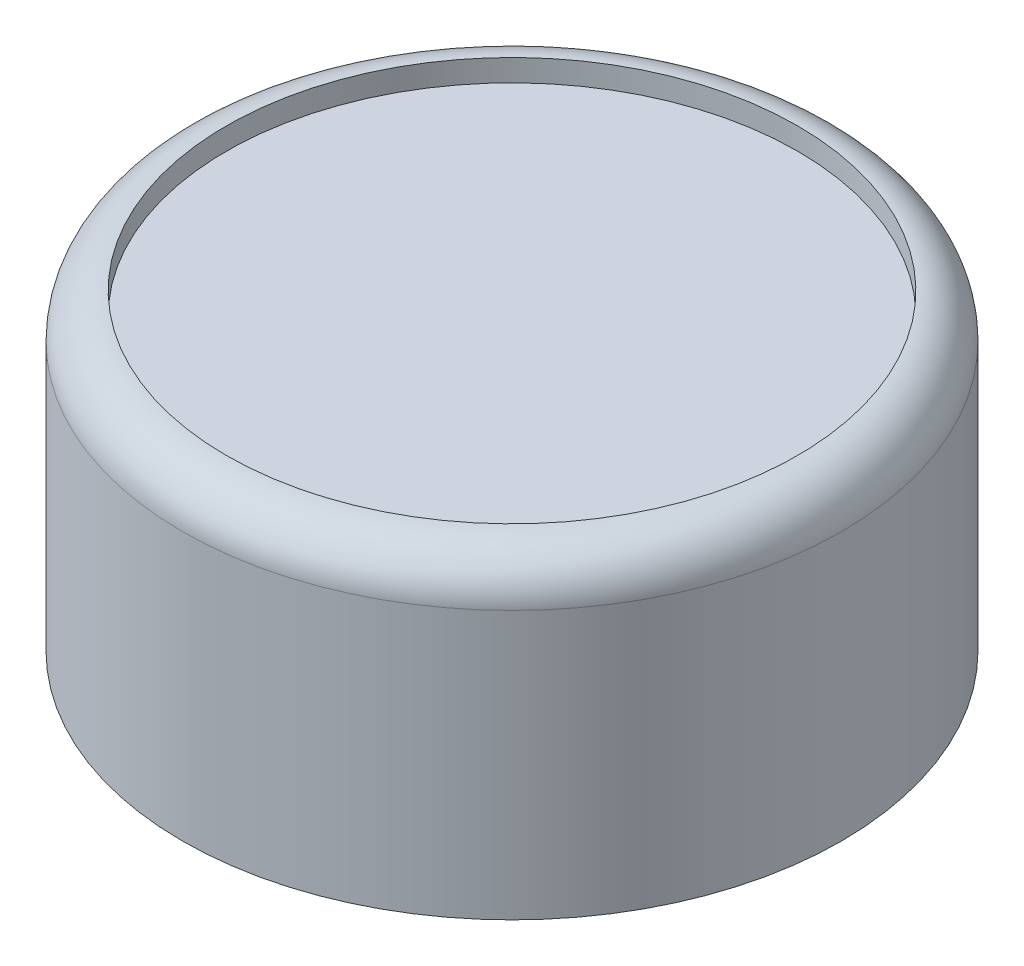
ISO-10303-21;
HEADER;
FILE_DESCRIPTION(('STEP AP214'),'2;1');
FILE_NAME('part.step','',(''),(''),'','','');
FILE_SCHEMA(('AUTOMOTIVE_DESIGN { 1 0 10303 214 1 1 1 1 }'));
ENDSEC;
DATA;
#1=APPLICATION_CONTEXT('core data for automotive mechanical design processes');
#2=APPLICATION_PROTOCOL_DEFINITION('international standard','automotive_design',2000,#1);
#3=PRODUCT_CONTEXT('',#1,'mechanical');
#4=PRODUCT('Part','Part','',(#3));
#5=PRODUCT_RELATED_PRODUCT_CATEGORY('part','',(#4));
#6=PRODUCT_DEFINITION_FORMATION('','',#4);
#7=PRODUCT_DEFINITION_CONTEXT('part definition',#1,'design');
#8=PRODUCT_DEFINITION('design','',#6,#7);
#9=PRODUCT_DEFINITION_SHAPE('','',#8);
#10=(LENGTH_UNIT() NAMED_UNIT(*) SI_UNIT(.MILLI.,.METRE.));
#11=(NAMED_UNIT(*) PLANE_ANGLE_UNIT() SI_UNIT($,.RADIAN.));
#12=(NAMED_UNIT(*) SI_UNIT($,.STERADIAN.) SOLID_ANGLE_UNIT());
#13=UNCERTAINTY_MEASURE_WITH_UNIT(LENGTH_MEASURE(1.E-05),#10,'distance_accuracy_value','');
#14=(GEOMETRIC_REPRESENTATION_CONTEXT(3) GLOBAL_UNCERTAINTY_ASSIGNED_CONTEXT((#13)) GLOBAL_UNIT_ASSIGNED_CONTEXT((#10,
#11,#12)) REPRESENTATION_CONTEXT('',''));
#15=CARTESIAN_POINT('',(0.,0.,0.));
#16=DIRECTION('',(0.,0.,1.));
#17=DIRECTION('',(1.,0.,0.));
#18=AXIS2_PLACEMENT_3D('',#15,#16,#17);
#19=CARTESIAN_POINT('',(0.,-2.,0.));
#20=DIRECTION('',(0.,1.,0.));
#21=DIRECTION('',(0.,0.,1.));
#22=AXIS2_PLACEMENT_3D('',#19,#20,#21);
#23=PLANE('',#22);
#24=DIRECTION('',(1.,0.,0.));
#25=VECTOR('',#24,1.);
#26=CARTESIAN_POINT('',(0.,-2.,-1.));
#27=LINE('',#26,#25);
#28=CARTESIAN_POINT('',(-12.9614813968157,-2.,-1.00000000000014));
#29=VERTEX_POINT('',#28);
#30=CARTESIAN_POINT('',(-5.10294032886922,-2.,-1.00000000000005));
#31=VERTEX_POINT('',#30);
#32=EDGE_CURVE('E213',#29,#31,#27,.T.);
#33=ORIENTED_EDGE('',*,*,#32,.F.);
#34=CARTESIAN_POINT('',(0.,-2.,0.));
#35=DIRECTION('',(0.,1.,0.));
#36=DIRECTION('',(0.,0.,1.));
#37=AXIS2_PLACEMENT_3D('',#34,#35,#36);
#38=CIRCLE('',#37,13.);
#39=CARTESIAN_POINT('',(-1.,-2.,-12.9614813968157));
#40=VERTEX_POINT('',#39);
#41=EDGE_CURVE('E196',#40,#29,#38,.T.);
#42=ORIENTED_EDGE('',*,*,#41,.F.);
#43=DIRECTION('',(0.,0.,1.));
#44=VECTOR('',#43,1.);
#45=CARTESIAN_POINT('',(-1.,-2.,0.));
#46=LINE('',#45,#44);
#47=CARTESIAN_POINT('',(-1.,-2.,-3.2));
#48=VERTEX_POINT('',#47);
#49=EDGE_CURVE('E318',#40,#48,#46,.T.);
#50=ORIENTED_EDGE('',*,*,#49,.T.);
#51=DIRECTION('',(1.,0.,0.));
#52=VECTOR('',#51,1.);
#53=CARTESIAN_POINT('',(-2.96647939483827,-2.,-3.2));
#54=LINE('',#53,#52);
#55=CARTESIAN_POINT('',(-4.09878030638384,-2.,-3.2));
#56=VERTEX_POINT('',#55);
#57=EDGE_CURVE('E359',#56,#48,#54,.T.);
#58=ORIENTED_EDGE('',*,*,#57,.F.);
#59=CARTESIAN_POINT('',(0.,-2.,0.));
#60=DIRECTION('',(0.,-1.,0.));
#61=DIRECTION('',(1.,0.,0.));
#62=AXIS2_PLACEMENT_3D('',#59,#60,#61);
#63=CIRCLE('',#62,5.2);
#64=EDGE_CURVE('E215',#31,#56,#63,.T.);
#65=ORIENTED_EDGE('',*,*,#64,.F.);
#66=EDGE_LOOP('',(#33,#42,#50,#58,#65));
#67=FACE_BOUND('',#66,.T.);
#68=ADVANCED_FACE('F57',(#67),#23,.F.);
#69=CARTESIAN_POINT('',(0.,-9.,0.));
#70=DIRECTION('',(0.,1.,0.));
#71=DIRECTION('',(0.,0.,1.));
#72=AXIS2_PLACEMENT_3D('',#69,#70,#71);
#73=CYLINDRICAL_SURFACE('',#72,5.2);
#74=DIRECTION('',(0.,1.,0.));
#75=VECTOR('',#74,1.);
#76=CARTESIAN_POINT('',(-5.10294032886922,-9.,-1.00000000000005));
#77=LINE('',#76,#75);
#78=CARTESIAN_POINT('',(-5.10294032886922,-9.,-1.00000000000005));
#79=VERTEX_POINT('',#78);
#80=EDGE_CURVE('E73',#31,#79,#77,.F.);
#81=ORIENTED_EDGE('',*,*,#80,.F.);
#82=ORIENTED_EDGE('',*,*,#64,.T.);
#83=DIRECTION('',(0.,1.,0.));
#84=VECTOR('',#83,1.);
#85=CARTESIAN_POINT('',(-4.09878030638384,-9.,-3.2));
#86=LINE('',#85,#84);
#87=CARTESIAN_POINT('',(-4.09878030638384,-9.,-3.2));
#88=VERTEX_POINT('',#87);
#89=EDGE_CURVE('E366',#88,#56,#86,.T.);
#90=ORIENTED_EDGE('',*,*,#89,.F.);
#91=CARTESIAN_POINT('',(0.,-9.,0.));
#92=DIRECTION('',(0.,-1.,0.));
#93=DIRECTION('',(1.,0.,0.));
#94=AXIS2_PLACEMENT_3D('',#91,#92,#93);
#95=CIRCLE('',#94,5.2);
#96=EDGE_CURVE('E347',#79,#88,#95,.T.);
#97=ORIENTED_EDGE('',*,*,#96,.F.);
#98=EDGE_LOOP('',(#81,#82,#90,#97));
#99=FACE_BOUND('',#98,.T.);
#100=ADVANCED_FACE('F416',(#99),#73,.T.);
#101=CARTESIAN_POINT('',(-12.9614813968157,-2.,0.999999999999864));
#102=VERTEX_POINT('',#101);
#103=CARTESIAN_POINT('',(-1.,-2.,12.9614813968157));
#104=VERTEX_POINT('',#103);
#105=EDGE_CURVE('E209',#102,#104,#38,.T.);
#106=ORIENTED_EDGE('',*,*,#105,.F.);
#107=DIRECTION('',(1.,0.,0.));
#108=VECTOR('',#107,1.);
#109=CARTESIAN_POINT('',(0.,-2.,1.));
#110=LINE('',#109,#108);
#111=CARTESIAN_POINT('',(-5.10294032886924,-2.,0.999999999999947));
#112=VERTEX_POINT('',#111);
#113=EDGE_CURVE('E81',#102,#112,#110,.T.);
#114=ORIENTED_EDGE('',*,*,#113,.T.);
#115=CARTESIAN_POINT('',(-1.,-2.,5.10294032886923));
#116=VERTEX_POINT('',#115);
#117=EDGE_CURVE('E418',#116,#112,#63,.T.);
#118=ORIENTED_EDGE('',*,*,#117,.F.);
#119=DIRECTION('',(0.,0.,-1.));
#120=VECTOR('',#119,1.);
#121=CARTESIAN_POINT('',(-1.,-2.,0.));
#122=LINE('',#121,#120);
#123=EDGE_CURVE('E252',#104,#116,#122,.T.);
#124=ORIENTED_EDGE('',*,*,#123,.F.);
#125=EDGE_LOOP('',(#106,#114,#118,#124));
#126=FACE_BOUND('',#125,.T.);
#127=ADVANCED_FACE('F472',(#126),#23,.F.);
#128=ORIENTED_EDGE('',*,*,#117,.T.);
#129=DIRECTION('',(0.,1.,0.));
#130=VECTOR('',#129,1.);
#131=CARTESIAN_POINT('',(-5.10294032886924,-9.,0.999999999999947));
#132=LINE('',#131,#130);
#133=CARTESIAN_POINT('',(-5.10294032886924,-9.,0.999999999999947));
#134=VERTEX_POINT('',#133);
#135=EDGE_CURVE('E238',#112,#134,#132,.F.);
#136=ORIENTED_EDGE('',*,*,#135,.T.);
#137=CARTESIAN_POINT('',(-1.,-9.,5.10294032886923));
#138=VERTEX_POINT('',#137);
#139=EDGE_CURVE('E401',#138,#134,#95,.T.);
#140=ORIENTED_EDGE('',*,*,#139,.F.);
#141=DIRECTION('',(0.,1.,0.));
#142=VECTOR('',#141,1.);
#143=CARTESIAN_POINT('',(-1.,-9.,5.10294032886923));
#144=LINE('',#143,#142);
#145=EDGE_CURVE('E382',#116,#138,#144,.F.);
#146=ORIENTED_EDGE('',*,*,#145,.F.);
#147=EDGE_LOOP('',(#128,#136,#140,#146));
#148=FACE_BOUND('',#147,.T.);
#149=ADVANCED_FACE('F404',(#148),#73,.T.);
#150=CARTESIAN_POINT('',(12.9614813968157,-2.,-0.999999999999955));
#151=VERTEX_POINT('',#150);
#152=CARTESIAN_POINT('',(1.,-2.,-12.9614813968157));
#153=VERTEX_POINT('',#152);
#154=EDGE_CURVE('E211',#151,#153,#38,.T.);
#155=ORIENTED_EDGE('',*,*,#154,.F.);
#156=DIRECTION('',(-1.,0.,0.));
#157=VECTOR('',#156,1.);
#158=CARTESIAN_POINT('',(0.,-2.,-1.));
#159=LINE('',#158,#157);
#160=CARTESIAN_POINT('',(5.10294032886923,-2.,-0.999999999999982));
#161=VERTEX_POINT('',#160);
#162=EDGE_CURVE('E285',#151,#161,#159,.T.);
#163=ORIENTED_EDGE('',*,*,#162,.T.);
#164=CARTESIAN_POINT('',(4.09878030638384,-2.,-3.2));
#165=VERTEX_POINT('',#164);
#166=EDGE_CURVE('E353',#165,#161,#63,.T.);
#167=ORIENTED_EDGE('',*,*,#166,.F.);
#168=CARTESIAN_POINT('',(1.,-2.,-3.2));
#169=VERTEX_POINT('',#168);
#170=EDGE_CURVE('E357',#169,#165,#54,.T.);
#171=ORIENTED_EDGE('',*,*,#170,.F.);
#172=DIRECTION('',(0.,0.,1.));
#173=VECTOR('',#172,1.);
#174=CARTESIAN_POINT('',(1.,-2.,0.));
#175=LINE('',#174,#173);
#176=EDGE_CURVE('E313',#153,#169,#175,.T.);
#177=ORIENTED_EDGE('',*,*,#176,.F.);
#178=EDGE_LOOP('',(#155,#163,#167,#171,#177));
#179=FACE_BOUND('',#178,.T.);
#180=ADVANCED_FACE('F430',(#179),#23,.F.);
#181=ORIENTED_EDGE('',*,*,#166,.T.);
#182=DIRECTION('',(0.,1.,0.));
#183=VECTOR('',#182,1.);
#184=CARTESIAN_POINT('',(5.10294032886923,-9.,-0.999999999999982));
#185=LINE('',#184,#183);
#186=CARTESIAN_POINT('',(5.10294032886923,-9.,-0.999999999999982));
#187=VERTEX_POINT('',#186);
#188=EDGE_CURVE('E378',#161,#187,#185,.F.);
#189=ORIENTED_EDGE('',*,*,#188,.T.);
#190=CARTESIAN_POINT('',(4.09878030638384,-9.,-3.2));
#191=VERTEX_POINT('',#190);
#192=EDGE_CURVE('E341',#191,#187,#95,.T.);
#193=ORIENTED_EDGE('',*,*,#192,.F.);
#194=DIRECTION('',(0.,1.,0.));
#195=VECTOR('',#194,1.);
#196=CARTESIAN_POINT('',(4.09878030638384,-9.,-3.2));
#197=LINE('',#196,#195);
#198=EDGE_CURVE('E352',#191,#165,#197,.T.);
#199=ORIENTED_EDGE('',*,*,#198,.T.);
#200=EDGE_LOOP('',(#181,#189,#193,#199));
#201=FACE_BOUND('',#200,.T.);
#202=ADVANCED_FACE('F507',(#201),#73,.T.);
#203=CARTESIAN_POINT('',(-2.96647939483827,-9.,-3.2));
#204=DIRECTION('',(0.,0.,1.));
#205=DIRECTION('',(1.,0.,0.));
#206=AXIS2_PLACEMENT_3D('',#203,#204,#205);
#207=PLANE('',#206);
#208=DIRECTION('',(0.,1.,0.));
#209=VECTOR('',#208,1.);
#210=CARTESIAN_POINT('',(1.,-9.,-3.2));
#211=LINE('',#210,#209);
#212=CARTESIAN_POINT('',(1.,-9.,-3.2));
#213=VERTEX_POINT('',#212);
#214=EDGE_CURVE('E293',#213,#169,#211,.T.);
#215=ORIENTED_EDGE('',*,*,#214,.T.);
#216=ORIENTED_EDGE('',*,*,#170,.T.);
#217=ORIENTED_EDGE('',*,*,#198,.F.);
#218=DIRECTION('',(1.,0.,0.));
#219=VECTOR('',#218,1.);
#220=CARTESIAN_POINT('',(-2.96647939483827,-9.,-3.2));
#221=LINE('',#220,#219);
#222=EDGE_CURVE('E345',#213,#191,#221,.T.);
#223=ORIENTED_EDGE('',*,*,#222,.F.);
#224=EDGE_LOOP('',(#215,#216,#217,#223));
#225=FACE_BOUND('',#224,.T.);
#226=ADVANCED_FACE('F498',(#225),#207,.F.);
#227=CARTESIAN_POINT('',(1.,-2.,12.9614813968157));
#228=VERTEX_POINT('',#227);
#229=CARTESIAN_POINT('',(12.9614813968157,-2.,1.00000000000005));
#230=VERTEX_POINT('',#229);
#231=EDGE_CURVE('E723',#228,#230,#38,.T.);
#232=ORIENTED_EDGE('',*,*,#231,.F.);
#233=DIRECTION('',(0.,0.,-1.));
#234=VECTOR('',#233,1.);
#235=CARTESIAN_POINT('',(1.,-2.,0.));
#236=LINE('',#235,#234);
#237=CARTESIAN_POINT('',(1.,-2.,5.10294032886923));
#238=VERTEX_POINT('',#237);
#239=EDGE_CURVE('E259',#228,#238,#236,.T.);
#240=ORIENTED_EDGE('',*,*,#239,.T.);
#241=CARTESIAN_POINT('',(5.10294032886923,-2.,1.00000000000002));
#242=VERTEX_POINT('',#241);
#243=EDGE_CURVE('E358',#242,#238,#63,.T.);
#244=ORIENTED_EDGE('',*,*,#243,.F.);
#245=DIRECTION('',(-1.,0.,0.));
#246=VECTOR('',#245,1.);
#247=CARTESIAN_POINT('',(0.,-2.,1.));
#248=LINE('',#247,#246);
#249=EDGE_CURVE('E278',#230,#242,#248,.T.);
#250=ORIENTED_EDGE('',*,*,#249,.F.);
#251=EDGE_LOOP('',(#232,#240,#244,#250));
#252=FACE_BOUND('',#251,.T.);
#253=ADVANCED_FACE('F486',(#252),#23,.F.);
#254=CARTESIAN_POINT('',(0.,-14.2,0.));
#255=DIRECTION('',(0.,1.,0.));
#256=DIRECTION('',(0.,0.,1.));
#257=AXIS2_PLACEMENT_3D('',#254,#255,#256);
#258=CYLINDRICAL_SURFACE('',#257,15.);
#259=CARTESIAN_POINT('',(0.,-2.,0.));
#260=DIRECTION('',(0.,1.,0.));
#261=DIRECTION('',(0.,0.,1.));
#262=AXIS2_PLACEMENT_3D('',#259,#260,#261);
#263=CIRCLE('',#262,15.);
#264=CARTESIAN_POINT('',(0.,-2.,15.));
#265=VERTEX_POINT('',#264);
#266=EDGE_CURVE('E12',#265,#265,#263,.F.);
#267=ORIENTED_EDGE('',*,*,#266,.T.);
#268=EDGE_LOOP('',(#267));
#269=FACE_BOUND('',#268,.T.);
#270=CARTESIAN_POINT('',(0.,-14.2,0.));
#271=DIRECTION('',(0.,1.,0.));
#272=DIRECTION('',(0.,0.,1.));
#273=AXIS2_PLACEMENT_3D('',#270,#271,#272);
#274=CIRCLE('',#273,15.);
#275=CARTESIAN_POINT('',(0.,-14.2,15.));
#276=VERTEX_POINT('',#275);
#277=EDGE_CURVE('E373',#276,#276,#274,.T.);
#278=ORIENTED_EDGE('',*,*,#277,.T.);
#279=EDGE_LOOP('',(#278));
#280=FACE_BOUND('',#279,.T.);
#281=ADVANCED_FACE('F497',(#269,#280),#258,.T.);
#282=CARTESIAN_POINT('',(0.,-14.2,0.));
#283=DIRECTION('',(0.,1.,0.));
#284=DIRECTION('',(0.,0.,1.));
#285=AXIS2_PLACEMENT_3D('',#282,#283,#284);
#286=PLANE('',#285);
#287=CARTESIAN_POINT('',(0.,-14.2,0.));
#288=DIRECTION('',(0.,1.,0.));
#289=DIRECTION('',(0.,0.,1.));
#290=AXIS2_PLACEMENT_3D('',#287,#288,#289);
#291=CIRCLE('',#290,13.);
#292=CARTESIAN_POINT('',(0.,-14.2,13.));
#293=VERTEX_POINT('',#292);
#294=EDGE_CURVE('E208',#293,#293,#291,.T.);
#295=ORIENTED_EDGE('',*,*,#294,.T.);
#296=EDGE_LOOP('',(#295));
#297=FACE_BOUND('',#296,.T.);
#298=ORIENTED_EDGE('',*,*,#277,.F.);
#299=EDGE_LOOP('',(#298));
#300=FACE_BOUND('',#299,.T.);
#301=ADVANCED_FACE('F504',(#297,#300),#286,.F.);
#302=CARTESIAN_POINT('',(0.,-14.2,0.));
#303=DIRECTION('',(0.,1.,0.));
#304=DIRECTION('',(0.,0.,1.));
#305=AXIS2_PLACEMENT_3D('',#302,#303,#304);
#306=CYLINDRICAL_SURFACE('',#305,13.);
#307=ORIENTED_EDGE('',*,*,#294,.F.);
#308=EDGE_LOOP('',(#307));
#309=FACE_BOUND('',#308,.T.);
#310=CARTESIAN_POINT('',(0.,-9.,0.));
#311=DIRECTION('',(0.,-1.,0.));
#312=DIRECTION('',(0.,0.,-1.));
#313=AXIS2_PLACEMENT_3D('',#310,#311,#312);
#314=CIRCLE('',#313,13.);
#315=CARTESIAN_POINT('',(-12.9614813968157,-9.,-1.00000000000014));
#316=VERTEX_POINT('',#315);
#317=CARTESIAN_POINT('',(-12.9614813968157,-9.,0.999999999999864));
#318=VERTEX_POINT('',#317);
#319=EDGE_CURVE('E224',#316,#318,#314,.F.);
#320=ORIENTED_EDGE('',*,*,#319,.T.);
#321=DIRECTION('',(0.,1.,0.));
#322=VECTOR('',#321,1.);
#323=CARTESIAN_POINT('',(-12.9614813968157,-14.2,0.999999999999864));
#324=LINE('',#323,#322);
#325=EDGE_CURVE('E233',#318,#102,#324,.T.);
#326=ORIENTED_EDGE('',*,*,#325,.T.);
#327=ORIENTED_EDGE('',*,*,#105,.T.);
#328=DIRECTION('',(0.,1.,0.));
#329=VECTOR('',#328,1.);
#330=CARTESIAN_POINT('',(-1.,-14.2,12.9614813968157));
#331=LINE('',#330,#329);
#332=CARTESIAN_POINT('',(-1.,-9.,12.9614813968157));
#333=VERTEX_POINT('',#332);
#334=EDGE_CURVE('E255',#333,#104,#331,.T.);
#335=ORIENTED_EDGE('',*,*,#334,.F.);
#336=CARTESIAN_POINT('',(0.,-9.,0.));
#337=DIRECTION('',(0.,-1.,0.));
#338=DIRECTION('',(0.,0.,-1.));
#339=AXIS2_PLACEMENT_3D('',#336,#337,#338);
#340=CIRCLE('',#339,13.);
#341=CARTESIAN_POINT('',(1.,-9.,12.9614813968157));
#342=VERTEX_POINT('',#341);
#343=EDGE_CURVE('E245',#333,#342,#340,.F.);
#344=ORIENTED_EDGE('',*,*,#343,.T.);
#345=DIRECTION('',(0.,1.,0.));
#346=VECTOR('',#345,1.);
#347=CARTESIAN_POINT('',(1.,-14.2,12.9614813968157));
#348=LINE('',#347,#346);
#349=EDGE_CURVE('E263',#342,#228,#348,.T.);
#350=ORIENTED_EDGE('',*,*,#349,.T.);
#351=ORIENTED_EDGE('',*,*,#231,.T.);
#352=DIRECTION('',(0.,1.,0.));
#353=VECTOR('',#352,1.);
#354=CARTESIAN_POINT('',(12.9614813968157,-14.2,1.00000000000005));
#355=LINE('',#354,#353);
#356=CARTESIAN_POINT('',(12.9614813968157,-9.,1.00000000000005));
#357=VERTEX_POINT('',#356);
#358=EDGE_CURVE('E281',#357,#230,#355,.T.);
#359=ORIENTED_EDGE('',*,*,#358,.F.);
#360=CARTESIAN_POINT('',(0.,-9.,0.));
#361=DIRECTION('',(0.,-1.,0.));
#362=DIRECTION('',(0.,0.,-1.));
#363=AXIS2_PLACEMENT_3D('',#360,#361,#362);
#364=CIRCLE('',#363,13.);
#365=CARTESIAN_POINT('',(12.9614813968157,-9.,-0.999999999999955));
#366=VERTEX_POINT('',#365);
#367=EDGE_CURVE('E271',#357,#366,#364,.F.);
#368=ORIENTED_EDGE('',*,*,#367,.T.);
#369=DIRECTION('',(0.,1.,0.));
#370=VECTOR('',#369,1.);
#371=CARTESIAN_POINT('',(12.9614813968157,-14.2,-0.999999999999955));
#372=LINE('',#371,#370);
#373=EDGE_CURVE('E289',#366,#151,#372,.T.);
#374=ORIENTED_EDGE('',*,*,#373,.T.);
#375=ORIENTED_EDGE('',*,*,#154,.T.);
#376=DIRECTION('',(0.,1.,0.));
#377=VECTOR('',#376,1.);
#378=CARTESIAN_POINT('',(1.,-14.2,-12.9614813968157));
#379=LINE('',#378,#377);
#380=CARTESIAN_POINT('',(1.,-9.,-12.9614813968157));
#381=VERTEX_POINT('',#380);
#382=EDGE_CURVE('E309',#381,#153,#379,.T.);
#383=ORIENTED_EDGE('',*,*,#382,.F.);
#384=CARTESIAN_POINT('',(0.,-9.,0.));
#385=DIRECTION('',(0.,-1.,0.));
#386=DIRECTION('',(0.,0.,-1.));
#387=AXIS2_PLACEMENT_3D('',#384,#385,#386);
#388=CIRCLE('',#387,13.);
#389=CARTESIAN_POINT('',(-1.,-9.,-12.9614813968157));
#390=VERTEX_POINT('',#389);
#391=EDGE_CURVE('E301',#381,#390,#388,.F.);
#392=ORIENTED_EDGE('',*,*,#391,.T.);
#393=DIRECTION('',(0.,1.,0.));
#394=VECTOR('',#393,1.);
#395=CARTESIAN_POINT('',(-1.,-14.2,-12.9614813968157));
#396=LINE('',#395,#394);
#397=EDGE_CURVE('E203',#390,#40,#396,.T.);
#398=ORIENTED_EDGE('',*,*,#397,.T.);
#399=ORIENTED_EDGE('',*,*,#41,.T.);
#400=DIRECTION('',(0.,1.,0.));
#401=VECTOR('',#400,1.);
#402=CARTESIAN_POINT('',(-12.9614813968157,-14.2,-1.00000000000014));
#403=LINE('',#402,#401);
#404=EDGE_CURVE('E200',#316,#29,#403,.T.);
#405=ORIENTED_EDGE('',*,*,#404,.F.);
#406=EDGE_LOOP('',(#320,#326,#327,#335,#344,#350,#351,#359,#368,#374,#375,#383,#392,#398,#399,#405));
#407=FACE_BOUND('',#406,.T.);
#408=ADVANCED_FACE('F198',(#309,#407),#306,.F.);
#409=CARTESIAN_POINT('',(0.,-9.,0.));
#410=DIRECTION('',(0.,-1.,0.));
#411=DIRECTION('',(0.,0.,-1.));
#412=AXIS2_PLACEMENT_3D('',#409,#410,#411);
#413=PLANE('',#412);
#414=ORIENTED_EDGE('',*,*,#139,.T.);
#415=DIRECTION('',(1.,0.,0.));
#416=VECTOR('',#415,1.);
#417=CARTESIAN_POINT('',(-13.,-9.,0.999999999999864));
#418=LINE('',#417,#416);
#419=EDGE_CURVE('E227',#318,#134,#418,.T.);
#420=ORIENTED_EDGE('',*,*,#419,.F.);
#421=ORIENTED_EDGE('',*,*,#319,.F.);
#422=DIRECTION('',(1.,0.,0.));
#423=VECTOR('',#422,1.);
#424=CARTESIAN_POINT('',(-13.,-9.,-1.00000000000014));
#425=LINE('',#424,#423);
#426=EDGE_CURVE('E222',#316,#79,#425,.T.);
#427=ORIENTED_EDGE('',*,*,#426,.T.);
#428=ORIENTED_EDGE('',*,*,#96,.T.);
#429=CARTESIAN_POINT('',(-1.,-9.,-3.2));
#430=VERTEX_POINT('',#429);
#431=EDGE_CURVE('E348',#88,#430,#221,.T.);
#432=ORIENTED_EDGE('',*,*,#431,.T.);
#433=DIRECTION('',(0.,0.,1.));
#434=VECTOR('',#433,1.);
#435=CARTESIAN_POINT('',(-1.,-9.,-13.));
#436=LINE('',#435,#434);
#437=EDGE_CURVE('E297',#390,#430,#436,.T.);
#438=ORIENTED_EDGE('',*,*,#437,.F.);
#439=ORIENTED_EDGE('',*,*,#391,.F.);
#440=DIRECTION('',(0.,0.,1.));
#441=VECTOR('',#440,1.);
#442=CARTESIAN_POINT('',(1.,-9.,-13.));
#443=LINE('',#442,#441);
#444=EDGE_CURVE('E298',#381,#213,#443,.T.);
#445=ORIENTED_EDGE('',*,*,#444,.T.);
#446=ORIENTED_EDGE('',*,*,#222,.T.);
#447=ORIENTED_EDGE('',*,*,#192,.T.);
#448=DIRECTION('',(-1.,0.,0.));
#449=VECTOR('',#448,1.);
#450=CARTESIAN_POINT('',(13.,-9.,-0.999999999999955));
#451=LINE('',#450,#449);
#452=EDGE_CURVE('E268',#366,#187,#451,.T.);
#453=ORIENTED_EDGE('',*,*,#452,.F.);
#454=ORIENTED_EDGE('',*,*,#367,.F.);
#455=DIRECTION('',(-1.,0.,0.));
#456=VECTOR('',#455,1.);
#457=CARTESIAN_POINT('',(13.,-9.,1.00000000000005));
#458=LINE('',#457,#456);
#459=CARTESIAN_POINT('',(5.10294032886923,-9.,1.00000000000002));
#460=VERTEX_POINT('',#459);
#461=EDGE_CURVE('E267',#357,#460,#458,.T.);
#462=ORIENTED_EDGE('',*,*,#461,.T.);
#463=CARTESIAN_POINT('',(1.,-9.,5.10294032886923));
#464=VERTEX_POINT('',#463);
#465=EDGE_CURVE('E346',#460,#464,#95,.T.);
#466=ORIENTED_EDGE('',*,*,#465,.T.);
#467=DIRECTION('',(0.,0.,-1.));
#468=VECTOR('',#467,1.);
#469=CARTESIAN_POINT('',(1.,-9.,13.));
#470=LINE('',#469,#468);
#471=EDGE_CURVE('E242',#342,#464,#470,.T.);
#472=ORIENTED_EDGE('',*,*,#471,.F.);
#473=ORIENTED_EDGE('',*,*,#343,.F.);
#474=DIRECTION('',(0.,0.,-1.));
#475=VECTOR('',#474,1.);
#476=CARTESIAN_POINT('',(-1.,-9.,13.));
#477=LINE('',#476,#475);
#478=EDGE_CURVE('E241',#333,#138,#477,.T.);
#479=ORIENTED_EDGE('',*,*,#478,.T.);
#480=EDGE_LOOP('',(#414,#420,#421,#427,#428,#432,#438,#439,#445,#446,#447,#453,#454,#462,#466,
#472,#473,#479));
#481=FACE_BOUND('',#480,.T.);
#482=DIRECTION('',(1.,0.,0.));
#483=VECTOR('',#482,1.);
#484=CARTESIAN_POINT('',(-2.96647939483827,-9.,-1.2));
#485=LINE('',#484,#483);
#486=CARTESIAN_POINT('',(-2.96647939483827,-9.,-1.2));
#487=VERTEX_POINT('',#486);
#488=CARTESIAN_POINT('',(2.96647939483827,-9.,-1.2));
#489=VERTEX_POINT('',#488);
#490=EDGE_CURVE('E325',#487,#489,#485,.T.);
#491=ORIENTED_EDGE('',*,*,#490,.F.);
#492=CARTESIAN_POINT('',(0.,-9.,0.));
#493=DIRECTION('',(0.,-1.,0.));
#494=DIRECTION('',(0.,0.,-1.));
#495=AXIS2_PLACEMENT_3D('',#492,#493,#494);
#496=CIRCLE('',#495,3.2);
#497=EDGE_CURVE('E322',#489,#487,#496,.T.);
#498=ORIENTED_EDGE('',*,*,#497,.F.);
#499=EDGE_LOOP('',(#491,#498));
#500=FACE_BOUND('',#499,.T.);
#501=ADVANCED_FACE('F398',(#481,#500),#413,.T.);
#502=ORIENTED_EDGE('',*,*,#243,.T.);
#503=DIRECTION('',(0.,1.,0.));
#504=VECTOR('',#503,1.);
#505=CARTESIAN_POINT('',(1.,-9.,5.10294032886923));
#506=LINE('',#505,#504);
#507=EDGE_CURVE('E66',#238,#464,#506,.F.);
#508=ORIENTED_EDGE('',*,*,#507,.T.);
#509=ORIENTED_EDGE('',*,*,#465,.F.);
#510=DIRECTION('',(0.,1.,0.));
#511=VECTOR('',#510,1.);
#512=CARTESIAN_POINT('',(5.10294032886923,-9.,1.00000000000002));
#513=LINE('',#512,#511);
#514=EDGE_CURVE('E377',#242,#460,#513,.F.);
#515=ORIENTED_EDGE('',*,*,#514,.F.);
#516=EDGE_LOOP('',(#502,#508,#509,#515));
#517=FACE_BOUND('',#516,.T.);
#518=ADVANCED_FACE('F479',(#517),#73,.T.);
#519=ORIENTED_EDGE('',*,*,#57,.T.);
#520=DIRECTION('',(0.,1.,0.));
#521=VECTOR('',#520,1.);
#522=CARTESIAN_POINT('',(-1.,-9.,-3.2));
#523=LINE('',#522,#521);
#524=EDGE_CURVE('E294',#430,#48,#523,.T.);
#525=ORIENTED_EDGE('',*,*,#524,.F.);
#526=ORIENTED_EDGE('',*,*,#431,.F.);
#527=ORIENTED_EDGE('',*,*,#89,.T.);
#528=EDGE_LOOP('',(#519,#525,#526,#527));
#529=FACE_BOUND('',#528,.T.);
#530=ADVANCED_FACE('F415',(#529),#207,.F.);
#531=CARTESIAN_POINT('',(0.,-9.,0.));
#532=DIRECTION('',(0.,1.,0.));
#533=DIRECTION('',(0.,0.,1.));
#534=AXIS2_PLACEMENT_3D('',#531,#532,#533);
#535=CYLINDRICAL_SURFACE('',#534,3.2);
#536=DIRECTION('',(0.,1.,0.));
#537=VECTOR('',#536,1.);
#538=CARTESIAN_POINT('',(-2.96647939483827,-9.,-1.2));
#539=LINE('',#538,#537);
#540=CARTESIAN_POINT('',(-2.96647939483827,-2.,-1.2));
#541=VERTEX_POINT('',#540);
#542=EDGE_CURVE('E337',#487,#541,#539,.T.);
#543=ORIENTED_EDGE('',*,*,#542,.T.);
#544=CARTESIAN_POINT('',(0.,-2.,0.));
#545=DIRECTION('',(0.,-1.,0.));
#546=DIRECTION('',(0.,0.,-1.));
#547=AXIS2_PLACEMENT_3D('',#544,#545,#546);
#548=CIRCLE('',#547,3.2);
#549=CARTESIAN_POINT('',(2.96647939483827,-2.,-1.2));
#550=VERTEX_POINT('',#549);
#551=EDGE_CURVE('E321',#550,#541,#548,.T.);
#552=ORIENTED_EDGE('',*,*,#551,.F.);
#553=DIRECTION('',(0.,1.,0.));
#554=VECTOR('',#553,1.);
#555=CARTESIAN_POINT('',(2.96647939483827,-9.,-1.2));
#556=LINE('',#555,#554);
#557=EDGE_CURVE('E329',#489,#550,#556,.T.);
#558=ORIENTED_EDGE('',*,*,#557,.F.);
#559=ORIENTED_EDGE('',*,*,#497,.T.);
#560=EDGE_LOOP('',(#543,#552,#558,#559));
#561=FACE_BOUND('',#560,.T.);
#562=ADVANCED_FACE('F493',(#561),#535,.F.);
#563=CARTESIAN_POINT('',(-2.96647939483827,-9.,-1.2));
#564=DIRECTION('',(0.,0.,1.));
#565=DIRECTION('',(1.,0.,0.));
#566=AXIS2_PLACEMENT_3D('',#563,#564,#565);
#567=PLANE('',#566);
#568=ORIENTED_EDGE('',*,*,#557,.T.);
#569=DIRECTION('',(1.,0.,0.));
#570=VECTOR('',#569,1.);
#571=CARTESIAN_POINT('',(-2.96647939483827,-2.,-1.2));
#572=LINE('',#571,#570);
#573=EDGE_CURVE('E326',#541,#550,#572,.T.);
#574=ORIENTED_EDGE('',*,*,#573,.F.);
#575=ORIENTED_EDGE('',*,*,#542,.F.);
#576=ORIENTED_EDGE('',*,*,#490,.T.);
#577=EDGE_LOOP('',(#568,#574,#575,#576));
#578=FACE_BOUND('',#577,.T.);
#579=ADVANCED_FACE('F484',(#578),#567,.T.);
#580=ORIENTED_EDGE('',*,*,#551,.T.);
#581=ORIENTED_EDGE('',*,*,#573,.T.);
#582=EDGE_LOOP('',(#580,#581));
#583=FACE_BOUND('',#582,.T.);
#584=ADVANCED_FACE('F473',(#583),#23,.F.);
#585=CARTESIAN_POINT('',(-1.,-9.,-13.));
#586=DIRECTION('',(-1.,0.,0.));
#587=DIRECTION('',(0.,0.,1.));
#588=AXIS2_PLACEMENT_3D('',#585,#586,#587);
#589=PLANE('',#588);
#590=ORIENTED_EDGE('',*,*,#49,.F.);
#591=ORIENTED_EDGE('',*,*,#397,.F.);
#592=ORIENTED_EDGE('',*,*,#437,.T.);
#593=ORIENTED_EDGE('',*,*,#524,.T.);
#594=EDGE_LOOP('',(#590,#591,#592,#593));
#595=FACE_BOUND('',#594,.T.);
#596=ADVANCED_FACE('F420',(#595),#589,.T.);
#597=CARTESIAN_POINT('',(1.,-9.,-13.));
#598=DIRECTION('',(-1.,0.,0.));
#599=DIRECTION('',(0.,0.,1.));
#600=AXIS2_PLACEMENT_3D('',#597,#598,#599);
#601=PLANE('',#600);
#602=ORIENTED_EDGE('',*,*,#382,.T.);
#603=ORIENTED_EDGE('',*,*,#176,.T.);
#604=ORIENTED_EDGE('',*,*,#214,.F.);
#605=ORIENTED_EDGE('',*,*,#444,.F.);
#606=EDGE_LOOP('',(#602,#603,#604,#605));
#607=FACE_BOUND('',#606,.T.);
#608=ADVANCED_FACE('F426',(#607),#601,.F.);
#609=CARTESIAN_POINT('',(13.,-9.,-0.999999999999955));
#610=DIRECTION('',(0.,0.,-1.));
#611=DIRECTION('',(-1.,0.,0.));
#612=AXIS2_PLACEMENT_3D('',#609,#610,#611);
#613=PLANE('',#612);
#614=ORIENTED_EDGE('',*,*,#373,.F.);
#615=ORIENTED_EDGE('',*,*,#452,.T.);
#616=ORIENTED_EDGE('',*,*,#188,.F.);
#617=ORIENTED_EDGE('',*,*,#162,.F.);
#618=EDGE_LOOP('',(#614,#615,#616,#617));
#619=FACE_BOUND('',#618,.T.);
#620=ADVANCED_FACE('F557',(#619),#613,.T.);
#621=CARTESIAN_POINT('',(13.,-9.,1.00000000000005));
#622=DIRECTION('',(0.,0.,-1.));
#623=DIRECTION('',(-1.,0.,0.));
#624=AXIS2_PLACEMENT_3D('',#621,#622,#623);
#625=PLANE('',#624);
#626=ORIENTED_EDGE('',*,*,#461,.F.);
#627=ORIENTED_EDGE('',*,*,#358,.T.);
#628=ORIENTED_EDGE('',*,*,#249,.T.);
#629=ORIENTED_EDGE('',*,*,#514,.T.);
#630=EDGE_LOOP('',(#626,#627,#628,#629));
#631=FACE_BOUND('',#630,.T.);
#632=ADVANCED_FACE('F609',(#631),#625,.F.);
#633=CARTESIAN_POINT('',(1.,-9.,13.));
#634=DIRECTION('',(1.,0.,0.));
#635=DIRECTION('',(0.,0.,-1.));
#636=AXIS2_PLACEMENT_3D('',#633,#634,#635);
#637=PLANE('',#636);
#638=ORIENTED_EDGE('',*,*,#349,.F.);
#639=ORIENTED_EDGE('',*,*,#471,.T.);
#640=ORIENTED_EDGE('',*,*,#507,.F.);
#641=ORIENTED_EDGE('',*,*,#239,.F.);
#642=EDGE_LOOP('',(#638,#639,#640,#641));
#643=FACE_BOUND('',#642,.T.);
#644=ADVANCED_FACE('F619',(#643),#637,.T.);
#645=CARTESIAN_POINT('',(-1.,-9.,13.));
#646=DIRECTION('',(1.,0.,0.));
#647=DIRECTION('',(0.,0.,-1.));
#648=AXIS2_PLACEMENT_3D('',#645,#646,#647);
#649=PLANE('',#648);
#650=ORIENTED_EDGE('',*,*,#478,.F.);
#651=ORIENTED_EDGE('',*,*,#334,.T.);
#652=ORIENTED_EDGE('',*,*,#123,.T.);
#653=ORIENTED_EDGE('',*,*,#145,.T.);
#654=EDGE_LOOP('',(#650,#651,#652,#653));
#655=FACE_BOUND('',#654,.T.);
#656=ADVANCED_FACE('F391',(#655),#649,.F.);
#657=CARTESIAN_POINT('',(-13.,-9.,0.999999999999864));
#658=DIRECTION('',(0.,0.,1.));
#659=DIRECTION('',(1.,0.,0.));
#660=AXIS2_PLACEMENT_3D('',#657,#658,#659);
#661=PLANE('',#660);
#662=ORIENTED_EDGE('',*,*,#135,.F.);
#663=ORIENTED_EDGE('',*,*,#113,.F.);
#664=ORIENTED_EDGE('',*,*,#325,.F.);
#665=ORIENTED_EDGE('',*,*,#419,.T.);
#666=EDGE_LOOP('',(#662,#663,#664,#665));
#667=FACE_BOUND('',#666,.T.);
#668=ADVANCED_FACE('F439',(#667),#661,.T.);
#669=CARTESIAN_POINT('',(-13.,-9.,-1.00000000000014));
#670=DIRECTION('',(0.,0.,1.));
#671=DIRECTION('',(1.,0.,0.));
#672=AXIS2_PLACEMENT_3D('',#669,#670,#671);
#673=PLANE('',#672);
#674=ORIENTED_EDGE('',*,*,#32,.T.);
#675=ORIENTED_EDGE('',*,*,#80,.T.);
#676=ORIENTED_EDGE('',*,*,#426,.F.);
#677=ORIENTED_EDGE('',*,*,#404,.T.);
#678=EDGE_LOOP('',(#674,#675,#676,#677));
#679=FACE_BOUND('',#678,.T.);
#680=ADVANCED_FACE('F220',(#679),#673,.F.);
#681=CARTESIAN_POINT('',(0.,-2.,0.));
#682=DIRECTION('',(0.,1.,0.));
#683=DIRECTION('',(0.,0.,1.));
#684=AXIS2_PLACEMENT_3D('',#681,#682,#683);
#685=TOROIDAL_SURFACE('',#684,13.,2.);
#686=ORIENTED_EDGE('',*,*,#266,.F.);
#687=EDGE_LOOP('',(#686));
#688=FACE_BOUND('',#687,.T.);
#689=CARTESIAN_POINT('',(0.,0.,0.));
#690=DIRECTION('',(0.,1.,0.));
#691=DIRECTION('',(0.,0.,1.));
#692=AXIS2_PLACEMENT_3D('',#689,#690,#691);
#693=CIRCLE('',#692,13.);
#694=CARTESIAN_POINT('',(0.,0.,13.));
#695=VERTEX_POINT('',#694);
#696=EDGE_CURVE('E446',#695,#695,#693,.T.);
#697=ORIENTED_EDGE('',*,*,#696,.F.);
#698=EDGE_LOOP('',(#697));
#699=FACE_BOUND('',#698,.T.);
#700=ADVANCED_FACE('F59',(#688,#699),#685,.T.);
#701=CARTESIAN_POINT('',(0.,-1.,0.));
#702=DIRECTION('',(0.,1.,0.));
#703=DIRECTION('',(0.,0.,1.));
#704=AXIS2_PLACEMENT_3D('',#701,#702,#703);
#705=CYLINDRICAL_SURFACE('',#704,13.);
#706=CARTESIAN_POINT('',(0.,-1.,0.));
#707=DIRECTION('',(0.,1.,0.));
#708=DIRECTION('',(0.,0.,1.));
#709=AXIS2_PLACEMENT_3D('',#706,#707,#708);
#710=CIRCLE('',#709,13.);
#711=CARTESIAN_POINT('',(0.,-1.,13.));
#712=VERTEX_POINT('',#711);
#713=EDGE_CURVE('E444',#712,#712,#710,.T.);
#714=ORIENTED_EDGE('',*,*,#713,.F.);
#715=EDGE_LOOP('',(#714));
#716=FACE_BOUND('',#715,.T.);
#717=ORIENTED_EDGE('',*,*,#696,.T.);
#718=EDGE_LOOP('',(#717));
#719=FACE_BOUND('',#718,.T.);
#720=ADVANCED_FACE('F456',(#716,#719),#705,.F.);
#721=CARTESIAN_POINT('',(0.,-1.,0.));
#722=DIRECTION('',(0.,1.,0.));
#723=DIRECTION('',(0.,0.,1.));
#724=AXIS2_PLACEMENT_3D('',#721,#722,#723);
#725=PLANE('',#724);
#726=ORIENTED_EDGE('',*,*,#713,.T.);
#727=EDGE_LOOP('',(#726));
#728=FACE_BOUND('',#727,.T.);
#729=ADVANCED_FACE('F454',(#728),#725,.T.);
#730=CLOSED_SHELL('',(#68,#100,#127,#149,#180,#202,#226,#253,#281,#301,#408,#501,#518,#530,#562,
#579,#584,#596,#608,#620,#632,#644,#656,#668,#680,#700,#720,#729));
#731=MANIFOLD_SOLID_BREP('B2',#730);
#732=ADVANCED_BREP_SHAPE_REPRESENTATION('',(#18,#731),#14);
#733=SHAPE_DEFINITION_REPRESENTATION(#9,#732);
ENDSEC;
END-ISO-10303-21;
